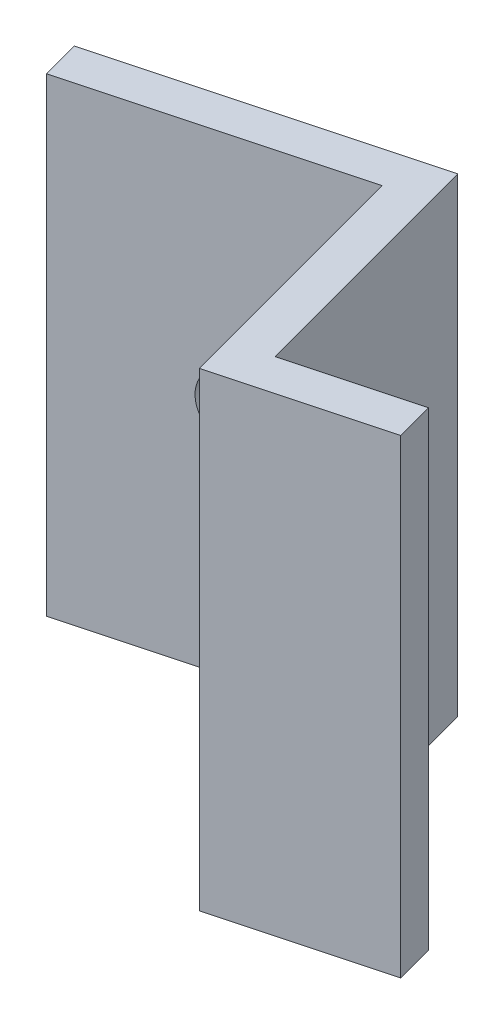
ISO-10303-21;
HEADER;
FILE_DESCRIPTION(('STEP AP214'),'2;1');
FILE_NAME('part.step','',(''),(''),'','','');
FILE_SCHEMA(('AUTOMOTIVE_DESIGN { 1 0 10303 214 1 1 1 1 }'));
ENDSEC;
DATA;
#1=APPLICATION_CONTEXT('core data for automotive mechanical design processes');
#2=APPLICATION_PROTOCOL_DEFINITION('international standard','automotive_design',2000,#1);
#3=PRODUCT_CONTEXT('',#1,'mechanical');
#4=PRODUCT('Part','Part','',(#3));
#5=PRODUCT_RELATED_PRODUCT_CATEGORY('part','',(#4));
#6=PRODUCT_DEFINITION_FORMATION('','',#4);
#7=PRODUCT_DEFINITION_CONTEXT('part definition',#1,'design');
#8=PRODUCT_DEFINITION('design','',#6,#7);
#9=PRODUCT_DEFINITION_SHAPE('','',#8);
#10=(LENGTH_UNIT() NAMED_UNIT(*) SI_UNIT(.MILLI.,.METRE.));
#11=(NAMED_UNIT(*) PLANE_ANGLE_UNIT() SI_UNIT($,.RADIAN.));
#12=(NAMED_UNIT(*) SI_UNIT($,.STERADIAN.) SOLID_ANGLE_UNIT());
#13=UNCERTAINTY_MEASURE_WITH_UNIT(LENGTH_MEASURE(1.E-05),#10,'distance_accuracy_value','');
#14=(GEOMETRIC_REPRESENTATION_CONTEXT(3) GLOBAL_UNCERTAINTY_ASSIGNED_CONTEXT((#13)) GLOBAL_UNIT_ASSIGNED_CONTEXT((#10,
#11,#12)) REPRESENTATION_CONTEXT('',''));
#15=CARTESIAN_POINT('',(0.,0.,0.));
#16=DIRECTION('',(0.,0.,1.));
#17=DIRECTION('',(1.,0.,0.));
#18=AXIS2_PLACEMENT_3D('',#15,#16,#17);
#19=CARTESIAN_POINT('',(-1297.67107755,-610.,3085.673892683));
#20=DIRECTION('',(-0.258819045102985,0.,-0.965925826288944));
#21=DIRECTION('',(0.,1.,0.));
#22=AXIS2_PLACEMENT_3D('',#19,#20,#21);
#23=CYLINDRICAL_SURFACE('',#22,4.5);
#24=CARTESIAN_POINT('',(-1297.645195645,-610.,3085.770485266));
#25=DIRECTION('',(-0.258819045102985,0.,-0.965925826288944));
#26=DIRECTION('',(0.,1.,0.));
#27=AXIS2_PLACEMENT_3D('',#24,#25,#26);
#28=CIRCLE('',#27,4.5);
#29=CARTESIAN_POINT('',(-1297.645195645,-605.5,3085.770485266));
#30=VERTEX_POINT('',#29);
#31=EDGE_CURVE('E154',#30,#30,#28,.T.);
#32=ORIENTED_EDGE('',*,*,#31,.T.);
#33=DIRECTION('',(0.258819045102985,0.,0.965925826288944));
#34=VECTOR('',#33,1.);
#35=CARTESIAN_POINT('',(-1297.67107755,-605.5,3085.673892683));
#36=LINE('',#35,#34);
#37=CARTESIAN_POINT('',(-1296.35110042,-605.5,3090.600114397));
#38=VERTEX_POINT('',#37);
#39=EDGE_CURVE('E11',#30,#38,#36,.T.);
#40=ORIENTED_EDGE('',*,*,#39,.T.);
#41=CARTESIAN_POINT('',(-1296.35110042,-610.,3090.600114397));
#42=DIRECTION('',(-0.258819045102985,0.,-0.965925826288944));
#43=DIRECTION('',(0.,1.,0.));
#44=AXIS2_PLACEMENT_3D('',#41,#42,#43);
#45=CIRCLE('',#44,4.5);
#46=EDGE_CURVE('E191',#38,#38,#45,.T.);
#47=ORIENTED_EDGE('',*,*,#46,.F.);
#48=ORIENTED_EDGE('',*,*,#39,.F.);
#49=EDGE_LOOP('',(#32,#40,#47,#48));
#50=FACE_BOUND('',#49,.T.);
#51=ADVANCED_FACE('F17',(#50),#23,.F.);
#52=CARTESIAN_POINT('',(-1278.326679119,-580.,3080.594104364));
#53=DIRECTION('',(0.,1.,0.));
#54=DIRECTION('',(1.,0.,0.));
#55=AXIS2_PLACEMENT_3D('',#52,#53,#54);
#56=PLANE('',#55);
#57=DIRECTION('',(0.258819045102985,0.,0.965925826288944));
#58=VECTOR('',#57,1.);
#59=CARTESIAN_POINT('',(-1278.326679119,-580.,3080.594104364));
#60=LINE('',#59,#58);
#61=CARTESIAN_POINT('',(-1278.326679119,-580.,3080.594104364));
#62=VERTEX_POINT('',#61);
#63=CARTESIAN_POINT('',(-1269.785650631,-580.,3112.469656631));
#64=VERTEX_POINT('',#63);
#65=EDGE_CURVE('E160',#62,#64,#60,.T.);
#66=ORIENTED_EDGE('',*,*,#65,.F.);
#67=DIRECTION('',(-0.965925826288944,0.,0.258819045102985));
#68=VECTOR('',#67,1.);
#69=CARTESIAN_POINT('',(-1278.326679119,-580.,3080.594104364));
#70=LINE('',#69,#68);
#71=CARTESIAN_POINT('',(-1316.963712171,-580.,3090.946866168));
#72=VERTEX_POINT('',#71);
#73=EDGE_CURVE('E159',#62,#72,#70,.T.);
#74=ORIENTED_EDGE('',*,*,#73,.T.);
#75=DIRECTION('',(0.258819045102985,0.,0.965925826288944));
#76=VECTOR('',#75,1.);
#77=CARTESIAN_POINT('',(-1316.963712171,-580.,3090.946866168));
#78=LINE('',#77,#76);
#79=CARTESIAN_POINT('',(-1315.669616946,-580.,3095.776495299));
#80=VERTEX_POINT('',#79);
#81=EDGE_CURVE('E180',#72,#80,#78,.T.);
#82=ORIENTED_EDGE('',*,*,#81,.T.);
#83=DIRECTION('',(-0.965925826288944,0.,0.258819045102985));
#84=VECTOR('',#83,1.);
#85=CARTESIAN_POINT('',(-1277.032583894,-580.,3085.423733495));
#86=LINE('',#85,#84);
#87=CARTESIAN_POINT('',(-1281.862213025,-580.,3086.717828721));
#88=VERTEX_POINT('',#87);
#89=EDGE_CURVE('E188',#88,#80,#86,.T.);
#90=ORIENTED_EDGE('',*,*,#89,.F.);
#91=DIRECTION('',(0.258819045102985,0.,0.965925826288944));
#92=VECTOR('',#91,1.);
#93=CARTESIAN_POINT('',(-1281.862213025,-580.,3086.717828721));
#94=LINE('',#93,#92);
#95=CARTESIAN_POINT('',(-1273.321184537,-580.,3118.593380988));
#96=VERTEX_POINT('',#95);
#97=EDGE_CURVE('E195',#88,#96,#94,.T.);
#98=ORIENTED_EDGE('',*,*,#97,.T.);
#99=DIRECTION('',(0.965925826288944,0.,-0.258819045102985));
#100=VECTOR('',#99,1.);
#101=CARTESIAN_POINT('',(-1273.321184537,-580.,3118.593380988));
#102=LINE('',#101,#100);
#103=CARTESIAN_POINT('',(-1253.036742185,-580.,3113.158181041));
#104=VERTEX_POINT('',#103);
#105=EDGE_CURVE('E205',#96,#104,#102,.T.);
#106=ORIENTED_EDGE('',*,*,#105,.T.);
#107=DIRECTION('',(0.258819045102985,0.,0.965925826288944));
#108=VECTOR('',#107,1.);
#109=CARTESIAN_POINT('',(-1254.33083741,-580.,3108.32855191));
#110=LINE('',#109,#108);
#111=CARTESIAN_POINT('',(-1254.33083741,-580.,3108.32855191));
#112=VERTEX_POINT('',#111);
#113=EDGE_CURVE('E46',#112,#104,#110,.T.);
#114=ORIENTED_EDGE('',*,*,#113,.F.);
#115=DIRECTION('',(-0.965925826288944,0.,0.258819045102985));
#116=VECTOR('',#115,1.);
#117=CARTESIAN_POINT('',(-1254.33083741,-580.,3108.32855191));
#118=LINE('',#117,#116);
#119=EDGE_CURVE('E26',#112,#64,#118,.T.);
#120=ORIENTED_EDGE('',*,*,#119,.T.);
#121=EDGE_LOOP('',(#66,#74,#82,#90,#98,#106,#114,#120));
#122=FACE_BOUND('',#121,.T.);
#123=ADVANCED_FACE('F19',(#122),#56,.T.);
#124=CARTESIAN_POINT('',(-1254.33083741,-640.,3108.32855191));
#125=DIRECTION('',(0.258819045102985,0.,0.965925826288944));
#126=DIRECTION('',(0.,-1.,0.));
#127=AXIS2_PLACEMENT_3D('',#124,#125,#126);
#128=PLANE('',#127);
#129=DIRECTION('',(0.,1.,0.));
#130=VECTOR('',#129,1.);
#131=CARTESIAN_POINT('',(-1269.785650631,-640.,3112.469656631));
#132=LINE('',#131,#130);
#133=CARTESIAN_POINT('',(-1269.785650631,-640.,3112.469656631));
#134=VERTEX_POINT('',#133);
#135=EDGE_CURVE('E164',#134,#64,#132,.T.);
#136=ORIENTED_EDGE('',*,*,#135,.T.);
#137=ORIENTED_EDGE('',*,*,#119,.F.);
#138=DIRECTION('',(0.,1.,0.));
#139=VECTOR('',#138,1.);
#140=CARTESIAN_POINT('',(-1254.33083741,-640.,3108.32855191));
#141=LINE('',#140,#139);
#142=CARTESIAN_POINT('',(-1254.33083741,-640.,3108.32855191));
#143=VERTEX_POINT('',#142);
#144=EDGE_CURVE('E109',#143,#112,#141,.T.);
#145=ORIENTED_EDGE('',*,*,#144,.F.);
#146=DIRECTION('',(-0.965925826288944,0.,0.258819045102985));
#147=VECTOR('',#146,1.);
#148=CARTESIAN_POINT('',(-1254.33083741,-640.,3108.32855191));
#149=LINE('',#148,#147);
#150=EDGE_CURVE('E113',#143,#134,#149,.T.);
#151=ORIENTED_EDGE('',*,*,#150,.T.);
#152=EDGE_LOOP('',(#136,#137,#145,#151));
#153=FACE_BOUND('',#152,.T.);
#154=ADVANCED_FACE('F111',(#153),#128,.F.);
#155=CARTESIAN_POINT('',(-1254.33083741,-640.,3108.32855191));
#156=DIRECTION('',(-0.965925826288944,0.,0.258819045102985));
#157=DIRECTION('',(0.,1.,0.));
#158=AXIS2_PLACEMENT_3D('',#155,#156,#157);
#159=PLANE('',#158);
#160=ORIENTED_EDGE('',*,*,#113,.T.);
#161=DIRECTION('',(0.,1.,0.));
#162=VECTOR('',#161,1.);
#163=CARTESIAN_POINT('',(-1253.036742185,-640.,3113.158181041));
#164=LINE('',#163,#162);
#165=CARTESIAN_POINT('',(-1253.036742185,-640.,3113.158181041));
#166=VERTEX_POINT('',#165);
#167=EDGE_CURVE('E120',#166,#104,#164,.T.);
#168=ORIENTED_EDGE('',*,*,#167,.F.);
#169=DIRECTION('',(0.258819045102985,0.,0.965925826288944));
#170=VECTOR('',#169,1.);
#171=CARTESIAN_POINT('',(-1254.33083741,-640.,3108.32855191));
#172=LINE('',#171,#170);
#173=EDGE_CURVE('E117',#143,#166,#172,.T.);
#174=ORIENTED_EDGE('',*,*,#173,.F.);
#175=ORIENTED_EDGE('',*,*,#144,.T.);
#176=EDGE_LOOP('',(#160,#168,#174,#175));
#177=FACE_BOUND('',#176,.T.);
#178=ADVANCED_FACE('F118',(#177),#159,.F.);
#179=CARTESIAN_POINT('',(-1268.491555406,-640.,3117.299285763));
#180=DIRECTION('',(0.258819045102985,0.,0.965925826288944));
#181=DIRECTION('',(0.,-1.,0.));
#182=AXIS2_PLACEMENT_3D('',#179,#180,#181);
#183=PLANE('',#182);
#184=DIRECTION('',(-0.965925826288944,0.,0.258819045102985));
#185=VECTOR('',#184,1.);
#186=CARTESIAN_POINT('',(-1253.036742185,-640.,3113.158181041));
#187=LINE('',#186,#185);
#188=CARTESIAN_POINT('',(-1273.321184537,-640.,3118.593380988));
#189=VERTEX_POINT('',#188);
#190=EDGE_CURVE('E125',#166,#189,#187,.T.);
#191=ORIENTED_EDGE('',*,*,#190,.F.);
#192=ORIENTED_EDGE('',*,*,#167,.T.);
#193=ORIENTED_EDGE('',*,*,#105,.F.);
#194=DIRECTION('',(0.,1.,0.));
#195=VECTOR('',#194,1.);
#196=CARTESIAN_POINT('',(-1273.321184537,-640.,3118.593380988));
#197=LINE('',#196,#195);
#198=EDGE_CURVE('E199',#189,#96,#197,.T.);
#199=ORIENTED_EDGE('',*,*,#198,.F.);
#200=EDGE_LOOP('',(#191,#192,#193,#199));
#201=FACE_BOUND('',#200,.T.);
#202=ADVANCED_FACE('F235',(#201),#183,.T.);
#203=CARTESIAN_POINT('',(-1281.862213025,-640.,3086.717828721));
#204=DIRECTION('',(-0.965925826288944,0.,0.258819045102985));
#205=DIRECTION('',(0.,1.,0.));
#206=AXIS2_PLACEMENT_3D('',#203,#204,#205);
#207=PLANE('',#206);
#208=ORIENTED_EDGE('',*,*,#97,.F.);
#209=DIRECTION('',(0.,1.,0.));
#210=VECTOR('',#209,1.);
#211=CARTESIAN_POINT('',(-1281.862213025,-640.,3086.717828721));
#212=LINE('',#211,#210);
#213=CARTESIAN_POINT('',(-1281.862213025,-640.,3086.717828721));
#214=VERTEX_POINT('',#213);
#215=EDGE_CURVE('E184',#214,#88,#212,.T.);
#216=ORIENTED_EDGE('',*,*,#215,.F.);
#217=DIRECTION('',(-0.258819045102985,0.,-0.965925826288944));
#218=VECTOR('',#217,1.);
#219=CARTESIAN_POINT('',(-1273.321184537,-640.,3118.593380988));
#220=LINE('',#219,#218);
#221=EDGE_CURVE('E147',#189,#214,#220,.T.);
#222=ORIENTED_EDGE('',*,*,#221,.F.);
#223=ORIENTED_EDGE('',*,*,#198,.T.);
#224=EDGE_LOOP('',(#208,#216,#222,#223));
#225=FACE_BOUND('',#224,.T.);
#226=ADVANCED_FACE('F233',(#225),#207,.T.);
#227=CARTESIAN_POINT('',(-1277.032583894,-640.,3085.423733495));
#228=DIRECTION('',(0.258819045102985,0.,0.965925826288944));
#229=DIRECTION('',(0.,-1.,0.));
#230=AXIS2_PLACEMENT_3D('',#227,#228,#229);
#231=PLANE('',#230);
#232=ORIENTED_EDGE('',*,*,#46,.T.);
#233=EDGE_LOOP('',(#232));
#234=FACE_BOUND('',#233,.T.);
#235=DIRECTION('',(-0.965925826288944,0.,0.258819045102985));
#236=VECTOR('',#235,1.);
#237=CARTESIAN_POINT('',(-1277.032583894,-640.,3085.423733495));
#238=LINE('',#237,#236);
#239=CARTESIAN_POINT('',(-1315.669616946,-640.,3095.776495299));
#240=VERTEX_POINT('',#239);
#241=EDGE_CURVE('E143',#214,#240,#238,.T.);
#242=ORIENTED_EDGE('',*,*,#241,.F.);
#243=ORIENTED_EDGE('',*,*,#215,.T.);
#244=ORIENTED_EDGE('',*,*,#89,.T.);
#245=DIRECTION('',(0.,1.,0.));
#246=VECTOR('',#245,1.);
#247=CARTESIAN_POINT('',(-1315.669616946,-640.,3095.776495299));
#248=LINE('',#247,#246);
#249=EDGE_CURVE('E158',#240,#80,#248,.T.);
#250=ORIENTED_EDGE('',*,*,#249,.F.);
#251=EDGE_LOOP('',(#242,#243,#244,#250));
#252=FACE_BOUND('',#251,.T.);
#253=ADVANCED_FACE('F230',(#234,#252),#231,.T.);
#254=CARTESIAN_POINT('',(-1316.963712171,-640.,3090.946866168));
#255=DIRECTION('',(-0.965925826288944,0.,0.258819045102985));
#256=DIRECTION('',(0.,1.,0.));
#257=AXIS2_PLACEMENT_3D('',#254,#255,#256);
#258=PLANE('',#257);
#259=DIRECTION('',(0.,1.,0.));
#260=VECTOR('',#259,1.);
#261=CARTESIAN_POINT('',(-1316.963712171,-640.,3090.946866168));
#262=LINE('',#261,#260);
#263=CARTESIAN_POINT('',(-1316.963712171,-640.,3090.946866168));
#264=VERTEX_POINT('',#263);
#265=EDGE_CURVE('E173',#264,#72,#262,.T.);
#266=ORIENTED_EDGE('',*,*,#265,.F.);
#267=DIRECTION('',(0.258819045102985,0.,0.965925826288944));
#268=VECTOR('',#267,1.);
#269=CARTESIAN_POINT('',(-1316.963712171,-640.,3090.946866168));
#270=LINE('',#269,#268);
#271=EDGE_CURVE('E141',#264,#240,#270,.T.);
#272=ORIENTED_EDGE('',*,*,#271,.T.);
#273=ORIENTED_EDGE('',*,*,#249,.T.);
#274=ORIENTED_EDGE('',*,*,#81,.F.);
#275=EDGE_LOOP('',(#266,#272,#273,#274));
#276=FACE_BOUND('',#275,.T.);
#277=ADVANCED_FACE('F222',(#276),#258,.T.);
#278=CARTESIAN_POINT('',(-1278.326679119,-640.,3080.594104364));
#279=DIRECTION('',(0.258819045102985,0.,0.965925826288944));
#280=DIRECTION('',(0.,-1.,0.));
#281=AXIS2_PLACEMENT_3D('',#278,#279,#280);
#282=PLANE('',#281);
#283=ORIENTED_EDGE('',*,*,#31,.F.);
#284=EDGE_LOOP('',(#283));
#285=FACE_BOUND('',#284,.T.);
#286=ORIENTED_EDGE('',*,*,#265,.T.);
#287=ORIENTED_EDGE('',*,*,#73,.F.);
#288=DIRECTION('',(0.,1.,0.));
#289=VECTOR('',#288,1.);
#290=CARTESIAN_POINT('',(-1278.326679119,-640.,3080.594104364));
#291=LINE('',#290,#289);
#292=CARTESIAN_POINT('',(-1278.326679119,-640.,3080.594104364));
#293=VERTEX_POINT('',#292);
#294=EDGE_CURVE('E169',#293,#62,#291,.T.);
#295=ORIENTED_EDGE('',*,*,#294,.F.);
#296=DIRECTION('',(-0.965925826288944,0.,0.258819045102985));
#297=VECTOR('',#296,1.);
#298=CARTESIAN_POINT('',(-1278.326679119,-640.,3080.594104364));
#299=LINE('',#298,#297);
#300=EDGE_CURVE('E139',#293,#264,#299,.T.);
#301=ORIENTED_EDGE('',*,*,#300,.T.);
#302=EDGE_LOOP('',(#286,#287,#295,#301));
#303=FACE_BOUND('',#302,.T.);
#304=ADVANCED_FACE('F217',(#285,#303),#282,.F.);
#305=CARTESIAN_POINT('',(-1278.326679119,-640.,3080.594104364));
#306=DIRECTION('',(-0.965925826288944,0.,0.258819045102985));
#307=DIRECTION('',(0.,1.,0.));
#308=AXIS2_PLACEMENT_3D('',#305,#306,#307);
#309=PLANE('',#308);
#310=ORIENTED_EDGE('',*,*,#65,.T.);
#311=ORIENTED_EDGE('',*,*,#135,.F.);
#312=DIRECTION('',(0.258819045102985,0.,0.965925826288944));
#313=VECTOR('',#312,1.);
#314=CARTESIAN_POINT('',(-1278.326679119,-640.,3080.594104364));
#315=LINE('',#314,#313);
#316=EDGE_CURVE('E131',#293,#134,#315,.T.);
#317=ORIENTED_EDGE('',*,*,#316,.F.);
#318=ORIENTED_EDGE('',*,*,#294,.T.);
#319=EDGE_LOOP('',(#310,#311,#317,#318));
#320=FACE_BOUND('',#319,.T.);
#321=ADVANCED_FACE('F214',(#320),#309,.F.);
#322=CARTESIAN_POINT('',(-1278.326679119,-640.,3080.594104364));
#323=DIRECTION('',(0.,1.,0.));
#324=DIRECTION('',(1.,0.,0.));
#325=AXIS2_PLACEMENT_3D('',#322,#323,#324);
#326=PLANE('',#325);
#327=ORIENTED_EDGE('',*,*,#150,.F.);
#328=ORIENTED_EDGE('',*,*,#173,.T.);
#329=ORIENTED_EDGE('',*,*,#190,.T.);
#330=ORIENTED_EDGE('',*,*,#221,.T.);
#331=ORIENTED_EDGE('',*,*,#241,.T.);
#332=ORIENTED_EDGE('',*,*,#271,.F.);
#333=ORIENTED_EDGE('',*,*,#300,.F.);
#334=ORIENTED_EDGE('',*,*,#316,.T.);
#335=EDGE_LOOP('',(#327,#328,#329,#330,#331,#332,#333,#334));
#336=FACE_BOUND('',#335,.T.);
#337=ADVANCED_FACE('F128',(#336),#326,.F.);
#338=CLOSED_SHELL('',(#51,#123,#154,#178,#202,#226,#253,#277,#304,#321,#337));
#339=MANIFOLD_SOLID_BREP('B1',#338);
#340=ADVANCED_BREP_SHAPE_REPRESENTATION('',(#18,#339),#14);
#341=SHAPE_DEFINITION_REPRESENTATION(#9,#340);
ENDSEC;
END-ISO-10303-21;
